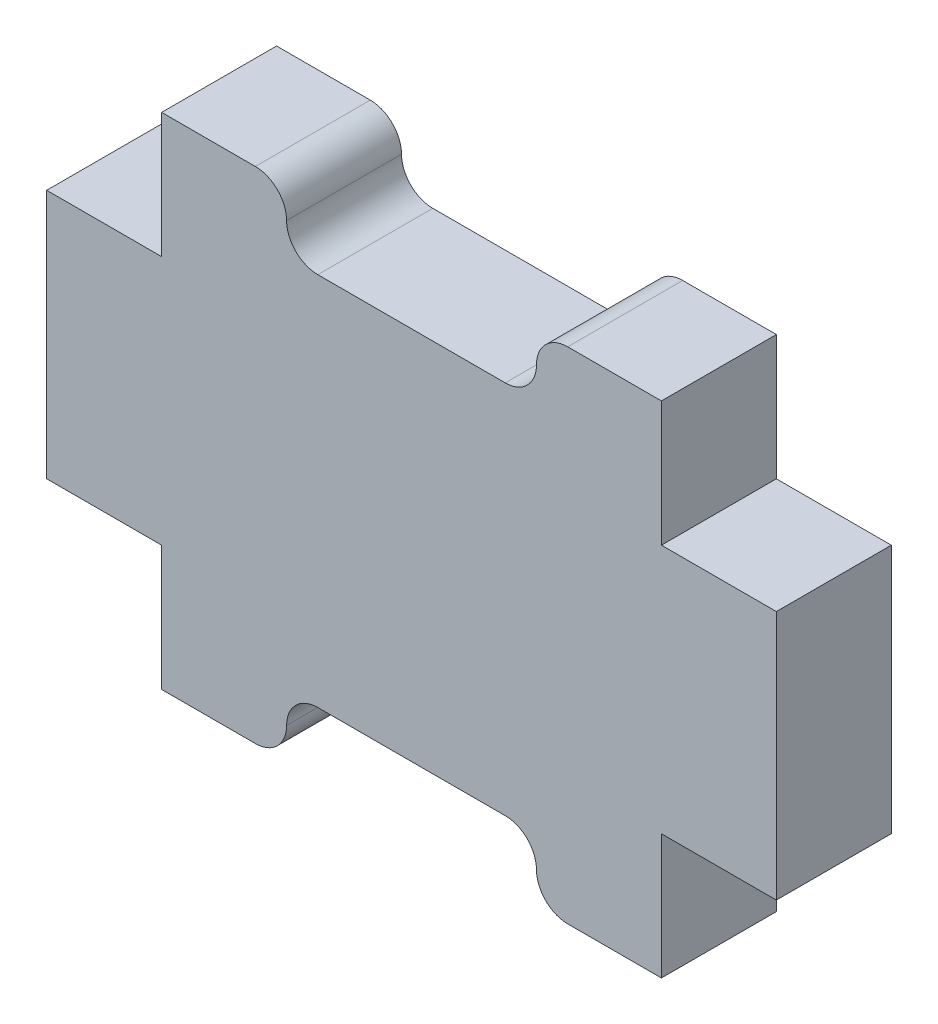
ISO-10303-21;
HEADER;
FILE_DESCRIPTION(('STEP AP214'),'2;1');
FILE_NAME('part.step','',(''),(''),'','','');
FILE_SCHEMA(('AUTOMOTIVE_DESIGN { 1 0 10303 214 1 1 1 1 }'));
ENDSEC;
DATA;
#1=APPLICATION_CONTEXT('core data for automotive mechanical design processes');
#2=APPLICATION_PROTOCOL_DEFINITION('international standard','automotive_design',2000,#1);
#3=PRODUCT_CONTEXT('',#1,'mechanical');
#4=PRODUCT('Part','Part','',(#3));
#5=PRODUCT_RELATED_PRODUCT_CATEGORY('part','',(#4));
#6=PRODUCT_DEFINITION_FORMATION('','',#4);
#7=PRODUCT_DEFINITION_CONTEXT('part definition',#1,'design');
#8=PRODUCT_DEFINITION('design','',#6,#7);
#9=PRODUCT_DEFINITION_SHAPE('','',#8);
#10=(LENGTH_UNIT() NAMED_UNIT(*) SI_UNIT(.MILLI.,.METRE.));
#11=(NAMED_UNIT(*) PLANE_ANGLE_UNIT() SI_UNIT($,.RADIAN.));
#12=(NAMED_UNIT(*) SI_UNIT($,.STERADIAN.) SOLID_ANGLE_UNIT());
#13=UNCERTAINTY_MEASURE_WITH_UNIT(LENGTH_MEASURE(1.E-05),#10,'distance_accuracy_value','');
#14=(GEOMETRIC_REPRESENTATION_CONTEXT(3) GLOBAL_UNCERTAINTY_ASSIGNED_CONTEXT((#13)) GLOBAL_UNIT_ASSIGNED_CONTEXT((#10,
#11,#12)) REPRESENTATION_CONTEXT('',''));
#15=CARTESIAN_POINT('',(0.,0.,0.));
#16=DIRECTION('',(0.,0.,1.));
#17=DIRECTION('',(1.,0.,0.));
#18=AXIS2_PLACEMENT_3D('',#15,#16,#17);
#19=CARTESIAN_POINT('',(0.,0.,5.842));
#20=DIRECTION('',(0.,1.,0.));
#21=DIRECTION('',(0.,0.,1.));
#22=AXIS2_PLACEMENT_3D('',#19,#20,#21);
#23=PLANE('',#22);
#24=DIRECTION('',(1.,0.,0.));
#25=VECTOR('',#24,1.);
#26=CARTESIAN_POINT('',(0.,0.,5.842));
#27=LINE('',#26,#25);
#28=CARTESIAN_POINT('',(-4.7625,0.,5.842));
#29=VERTEX_POINT('',#28);
#30=CARTESIAN_POINT('',(0.,0.,5.842));
#31=VERTEX_POINT('',#30);
#32=EDGE_CURVE('E221',#29,#31,#27,.T.);
#33=ORIENTED_EDGE('',*,*,#32,.F.);
#34=DIRECTION('',(0.,0.,1.));
#35=VECTOR('',#34,1.);
#36=CARTESIAN_POINT('',(-4.7625,0.,5.842));
#37=LINE('',#36,#35);
#38=CARTESIAN_POINT('',(-4.7625,0.,0.));
#39=VERTEX_POINT('',#38);
#40=EDGE_CURVE('E264',#29,#39,#37,.F.);
#41=ORIENTED_EDGE('',*,*,#40,.T.);
#42=DIRECTION('',(1.,0.,0.));
#43=VECTOR('',#42,1.);
#44=CARTESIAN_POINT('',(0.,0.,0.));
#45=LINE('',#44,#43);
#46=CARTESIAN_POINT('',(0.,0.,0.));
#47=VERTEX_POINT('',#46);
#48=EDGE_CURVE('E371',#39,#47,#45,.T.);
#49=ORIENTED_EDGE('',*,*,#48,.T.);
#50=DIRECTION('',(0.,0.,-1.));
#51=VECTOR('',#50,1.);
#52=CARTESIAN_POINT('',(0.,0.,5.842));
#53=LINE('',#52,#51);
#54=EDGE_CURVE('E323',#31,#47,#53,.T.);
#55=ORIENTED_EDGE('',*,*,#54,.F.);
#56=EDGE_LOOP('',(#33,#41,#49,#55));
#57=FACE_BOUND('',#56,.T.);
#58=ADVANCED_FACE('F39',(#57),#23,.F.);
#59=CARTESIAN_POINT('',(0.,25.4,5.842));
#60=DIRECTION('',(0.,-1.,0.));
#61=DIRECTION('',(0.,0.,-1.));
#62=AXIS2_PLACEMENT_3D('',#59,#60,#61);
#63=PLANE('',#62);
#64=DIRECTION('',(-1.,0.,0.));
#65=VECTOR('',#64,1.);
#66=CARTESIAN_POINT('',(0.,25.4,5.842));
#67=LINE('',#66,#65);
#68=CARTESIAN_POINT('',(-20.6375,25.4,5.842));
#69=VERTEX_POINT('',#68);
#70=CARTESIAN_POINT('',(-25.4,25.4,5.842));
#71=VERTEX_POINT('',#70);
#72=EDGE_CURVE('E292',#69,#71,#67,.T.);
#73=ORIENTED_EDGE('',*,*,#72,.F.);
#74=DIRECTION('',(0.,0.,1.));
#75=VECTOR('',#74,1.);
#76=CARTESIAN_POINT('',(-20.6375,25.4,5.842));
#77=LINE('',#76,#75);
#78=CARTESIAN_POINT('',(-20.6375,25.4,0.));
#79=VERTEX_POINT('',#78);
#80=EDGE_CURVE('E248',#69,#79,#77,.F.);
#81=ORIENTED_EDGE('',*,*,#80,.T.);
#82=DIRECTION('',(-1.,0.,0.));
#83=VECTOR('',#82,1.);
#84=CARTESIAN_POINT('',(0.,25.4,0.));
#85=LINE('',#84,#83);
#86=CARTESIAN_POINT('',(-25.4,25.4,0.));
#87=VERTEX_POINT('',#86);
#88=EDGE_CURVE('E413',#79,#87,#85,.T.);
#89=ORIENTED_EDGE('',*,*,#88,.T.);
#90=DIRECTION('',(0.,0.,-1.));
#91=VECTOR('',#90,1.);
#92=CARTESIAN_POINT('',(-25.4,25.4,5.842));
#93=LINE('',#92,#91);
#94=EDGE_CURVE('E391',#71,#87,#93,.T.);
#95=ORIENTED_EDGE('',*,*,#94,.F.);
#96=EDGE_LOOP('',(#73,#81,#89,#95));
#97=FACE_BOUND('',#96,.T.);
#98=ADVANCED_FACE('F475',(#97),#63,.F.);
#99=CARTESIAN_POINT('',(0.,0.,5.842));
#100=DIRECTION('',(-1.,0.,0.));
#101=DIRECTION('',(0.,0.,1.));
#102=AXIS2_PLACEMENT_3D('',#99,#100,#101);
#103=PLANE('',#102);
#104=DIRECTION('',(0.,1.,0.));
#105=VECTOR('',#104,1.);
#106=CARTESIAN_POINT('',(0.,0.,0.));
#107=LINE('',#106,#105);
#108=CARTESIAN_POINT('',(0.,6.34999999999999,0.));
#109=VERTEX_POINT('',#108);
#110=EDGE_CURVE('E230',#47,#109,#107,.T.);
#111=ORIENTED_EDGE('',*,*,#110,.T.);
#112=DIRECTION('',(0.,0.,-1.));
#113=VECTOR('',#112,1.);
#114=CARTESIAN_POINT('',(0.,6.34999999999999,5.842));
#115=LINE('',#114,#113);
#116=CARTESIAN_POINT('',(0.,6.34999999999999,5.842));
#117=VERTEX_POINT('',#116);
#118=EDGE_CURVE('E207',#117,#109,#115,.T.);
#119=ORIENTED_EDGE('',*,*,#118,.F.);
#120=DIRECTION('',(0.,1.,0.));
#121=VECTOR('',#120,1.);
#122=CARTESIAN_POINT('',(0.,0.,5.842));
#123=LINE('',#122,#121);
#124=EDGE_CURVE('E215',#31,#117,#123,.T.);
#125=ORIENTED_EDGE('',*,*,#124,.F.);
#126=ORIENTED_EDGE('',*,*,#54,.T.);
#127=EDGE_LOOP('',(#111,#119,#125,#126));
#128=FACE_BOUND('',#127,.T.);
#129=ADVANCED_FACE('F228',(#128),#103,.F.);
#130=CARTESIAN_POINT('',(0.,6.34999999999999,5.842));
#131=DIRECTION('',(0.,1.,0.));
#132=DIRECTION('',(-1.,0.,0.));
#133=AXIS2_PLACEMENT_3D('',#130,#131,#132);
#134=PLANE('',#133);
#135=DIRECTION('',(1.,0.,0.));
#136=VECTOR('',#135,1.);
#137=CARTESIAN_POINT('',(0.,6.34999999999999,0.));
#138=LINE('',#137,#136);
#139=CARTESIAN_POINT('',(5.842,6.35,0.));
#140=VERTEX_POINT('',#139);
#141=EDGE_CURVE('E415',#109,#140,#138,.T.);
#142=ORIENTED_EDGE('',*,*,#141,.T.);
#143=DIRECTION('',(0.,0.,-1.));
#144=VECTOR('',#143,1.);
#145=CARTESIAN_POINT('',(5.842,6.35,5.842));
#146=LINE('',#145,#144);
#147=CARTESIAN_POINT('',(5.842,6.35,5.842));
#148=VERTEX_POINT('',#147);
#149=EDGE_CURVE('E210',#148,#140,#146,.T.);
#150=ORIENTED_EDGE('',*,*,#149,.F.);
#151=DIRECTION('',(1.,0.,0.));
#152=VECTOR('',#151,1.);
#153=CARTESIAN_POINT('',(0.,6.34999999999999,5.842));
#154=LINE('',#153,#152);
#155=EDGE_CURVE('E203',#117,#148,#154,.T.);
#156=ORIENTED_EDGE('',*,*,#155,.F.);
#157=ORIENTED_EDGE('',*,*,#118,.T.);
#158=EDGE_LOOP('',(#142,#150,#156,#157));
#159=FACE_BOUND('',#158,.T.);
#160=ADVANCED_FACE('F205',(#159),#134,.F.);
#161=CARTESIAN_POINT('',(5.842,19.05,5.842));
#162=DIRECTION('',(-1.,0.,0.));
#163=DIRECTION('',(0.,-1.,0.));
#164=AXIS2_PLACEMENT_3D('',#161,#162,#163);
#165=PLANE('',#164);
#166=DIRECTION('',(0.,1.,0.));
#167=VECTOR('',#166,1.);
#168=CARTESIAN_POINT('',(5.842,19.05,0.));
#169=LINE('',#168,#167);
#170=CARTESIAN_POINT('',(5.842,19.05,0.));
#171=VERTEX_POINT('',#170);
#172=EDGE_CURVE('E410',#140,#171,#169,.T.);
#173=ORIENTED_EDGE('',*,*,#172,.T.);
#174=DIRECTION('',(0.,0.,-1.));
#175=VECTOR('',#174,1.);
#176=CARTESIAN_POINT('',(5.842,19.05,5.842));
#177=LINE('',#176,#175);
#178=CARTESIAN_POINT('',(5.842,19.05,5.842));
#179=VERTEX_POINT('',#178);
#180=EDGE_CURVE('E236',#179,#171,#177,.T.);
#181=ORIENTED_EDGE('',*,*,#180,.F.);
#182=DIRECTION('',(0.,1.,0.));
#183=VECTOR('',#182,1.);
#184=CARTESIAN_POINT('',(5.842,19.05,5.842));
#185=LINE('',#184,#183);
#186=EDGE_CURVE('E214',#148,#179,#185,.T.);
#187=ORIENTED_EDGE('',*,*,#186,.F.);
#188=ORIENTED_EDGE('',*,*,#149,.T.);
#189=EDGE_LOOP('',(#173,#181,#187,#188));
#190=FACE_BOUND('',#189,.T.);
#191=ADVANCED_FACE('F532',(#190),#165,.F.);
#192=CARTESIAN_POINT('',(0.,19.05,5.842));
#193=DIRECTION('',(0.,-1.,0.));
#194=DIRECTION('',(1.,0.,0.));
#195=AXIS2_PLACEMENT_3D('',#192,#193,#194);
#196=PLANE('',#195);
#197=DIRECTION('',(-1.,0.,0.));
#198=VECTOR('',#197,1.);
#199=CARTESIAN_POINT('',(0.,19.05,0.));
#200=LINE('',#199,#198);
#201=CARTESIAN_POINT('',(0.,19.05,0.));
#202=VERTEX_POINT('',#201);
#203=EDGE_CURVE('E406',#171,#202,#200,.T.);
#204=ORIENTED_EDGE('',*,*,#203,.T.);
#205=DIRECTION('',(0.,0.,-1.));
#206=VECTOR('',#205,1.);
#207=CARTESIAN_POINT('',(0.,19.05,5.842));
#208=LINE('',#207,#206);
#209=CARTESIAN_POINT('',(0.,19.05,5.842));
#210=VERTEX_POINT('',#209);
#211=EDGE_CURVE('E397',#210,#202,#208,.T.);
#212=ORIENTED_EDGE('',*,*,#211,.F.);
#213=DIRECTION('',(-1.,0.,0.));
#214=VECTOR('',#213,1.);
#215=CARTESIAN_POINT('',(0.,19.05,5.842));
#216=LINE('',#215,#214);
#217=EDGE_CURVE('E304',#179,#210,#216,.T.);
#218=ORIENTED_EDGE('',*,*,#217,.F.);
#219=ORIENTED_EDGE('',*,*,#180,.T.);
#220=EDGE_LOOP('',(#204,#212,#218,#219));
#221=FACE_BOUND('',#220,.T.);
#222=ADVANCED_FACE('F404',(#221),#196,.F.);
#223=CARTESIAN_POINT('',(0.,19.05,5.842));
#224=DIRECTION('',(-1.,0.,0.));
#225=DIRECTION('',(0.,0.,1.));
#226=AXIS2_PLACEMENT_3D('',#223,#224,#225);
#227=PLANE('',#226);
#228=DIRECTION('',(0.,1.,0.));
#229=VECTOR('',#228,1.);
#230=CARTESIAN_POINT('',(0.,19.05,0.));
#231=LINE('',#230,#229);
#232=CARTESIAN_POINT('',(0.,25.4,0.));
#233=VERTEX_POINT('',#232);
#234=EDGE_CURVE('E411',#202,#233,#231,.T.);
#235=ORIENTED_EDGE('',*,*,#234,.T.);
#236=DIRECTION('',(0.,0.,-1.));
#237=VECTOR('',#236,1.);
#238=CARTESIAN_POINT('',(0.,25.4,5.842));
#239=LINE('',#238,#237);
#240=CARTESIAN_POINT('',(0.,25.4,5.842));
#241=VERTEX_POINT('',#240);
#242=EDGE_CURVE('E394',#241,#233,#239,.T.);
#243=ORIENTED_EDGE('',*,*,#242,.F.);
#244=DIRECTION('',(0.,1.,0.));
#245=VECTOR('',#244,1.);
#246=CARTESIAN_POINT('',(0.,19.05,5.842));
#247=LINE('',#246,#245);
#248=EDGE_CURVE('E293',#210,#241,#247,.T.);
#249=ORIENTED_EDGE('',*,*,#248,.F.);
#250=ORIENTED_EDGE('',*,*,#211,.T.);
#251=EDGE_LOOP('',(#235,#243,#249,#250));
#252=FACE_BOUND('',#251,.T.);
#253=ADVANCED_FACE('F518',(#252),#227,.F.);
#254=CARTESIAN_POINT('',(-4.7625,25.4,0.));
#255=VERTEX_POINT('',#254);
#256=EDGE_CURVE('E418',#233,#255,#85,.T.);
#257=ORIENTED_EDGE('',*,*,#256,.T.);
#258=DIRECTION('',(0.,0.,1.));
#259=VECTOR('',#258,1.);
#260=CARTESIAN_POINT('',(-4.7625,25.4,5.842));
#261=LINE('',#260,#259);
#262=CARTESIAN_POINT('',(-4.7625,25.4,5.842));
#263=VERTEX_POINT('',#262);
#264=EDGE_CURVE('E261',#255,#263,#261,.T.);
#265=ORIENTED_EDGE('',*,*,#264,.T.);
#266=EDGE_CURVE('E286',#241,#263,#67,.T.);
#267=ORIENTED_EDGE('',*,*,#266,.F.);
#268=ORIENTED_EDGE('',*,*,#242,.T.);
#269=EDGE_LOOP('',(#257,#265,#267,#268));
#270=FACE_BOUND('',#269,.T.);
#271=ADVANCED_FACE('F472',(#270),#63,.F.);
#272=CARTESIAN_POINT('',(-25.4,19.05,5.842));
#273=DIRECTION('',(1.,0.,0.));
#274=DIRECTION('',(0.,1.,0.));
#275=AXIS2_PLACEMENT_3D('',#272,#273,#274);
#276=PLANE('',#275);
#277=DIRECTION('',(0.,-1.,0.));
#278=VECTOR('',#277,1.);
#279=CARTESIAN_POINT('',(-25.4,19.05,0.));
#280=LINE('',#279,#278);
#281=CARTESIAN_POINT('',(-25.4,19.05,0.));
#282=VERTEX_POINT('',#281);
#283=EDGE_CURVE('E420',#87,#282,#280,.T.);
#284=ORIENTED_EDGE('',*,*,#283,.T.);
#285=DIRECTION('',(0.,0.,-1.));
#286=VECTOR('',#285,1.);
#287=CARTESIAN_POINT('',(-25.4,19.05,5.842));
#288=LINE('',#287,#286);
#289=CARTESIAN_POINT('',(-25.4,19.05,5.842));
#290=VERTEX_POINT('',#289);
#291=EDGE_CURVE('E388',#290,#282,#288,.T.);
#292=ORIENTED_EDGE('',*,*,#291,.F.);
#293=DIRECTION('',(0.,-1.,0.));
#294=VECTOR('',#293,1.);
#295=CARTESIAN_POINT('',(-25.4,19.05,5.842));
#296=LINE('',#295,#294);
#297=EDGE_CURVE('E291',#71,#290,#296,.T.);
#298=ORIENTED_EDGE('',*,*,#297,.F.);
#299=ORIENTED_EDGE('',*,*,#94,.T.);
#300=EDGE_LOOP('',(#284,#292,#298,#299));
#301=FACE_BOUND('',#300,.T.);
#302=ADVANCED_FACE('F462',(#301),#276,.F.);
#303=CARTESIAN_POINT('',(-25.4,19.05,5.842));
#304=DIRECTION('',(0.,-1.,0.));
#305=DIRECTION('',(1.,0.,0.));
#306=AXIS2_PLACEMENT_3D('',#303,#304,#305);
#307=PLANE('',#306);
#308=DIRECTION('',(-1.,0.,0.));
#309=VECTOR('',#308,1.);
#310=CARTESIAN_POINT('',(-25.4,19.05,0.));
#311=LINE('',#310,#309);
#312=CARTESIAN_POINT('',(-31.242,19.05,0.));
#313=VERTEX_POINT('',#312);
#314=EDGE_CURVE('E422',#282,#313,#311,.T.);
#315=ORIENTED_EDGE('',*,*,#314,.T.);
#316=DIRECTION('',(0.,0.,-1.));
#317=VECTOR('',#316,1.);
#318=CARTESIAN_POINT('',(-31.242,19.05,5.842));
#319=LINE('',#318,#317);
#320=CARTESIAN_POINT('',(-31.242,19.05,5.842));
#321=VERTEX_POINT('',#320);
#322=EDGE_CURVE('E385',#321,#313,#319,.T.);
#323=ORIENTED_EDGE('',*,*,#322,.F.);
#324=DIRECTION('',(-1.,0.,0.));
#325=VECTOR('',#324,1.);
#326=CARTESIAN_POINT('',(-25.4,19.05,5.842));
#327=LINE('',#326,#325);
#328=EDGE_CURVE('E447',#290,#321,#327,.T.);
#329=ORIENTED_EDGE('',*,*,#328,.F.);
#330=ORIENTED_EDGE('',*,*,#291,.T.);
#331=EDGE_LOOP('',(#315,#323,#329,#330));
#332=FACE_BOUND('',#331,.T.);
#333=ADVANCED_FACE('F464',(#332),#307,.F.);
#334=CARTESIAN_POINT('',(-31.242,19.05,5.842));
#335=DIRECTION('',(1.,0.,0.));
#336=DIRECTION('',(0.,0.,-1.));
#337=AXIS2_PLACEMENT_3D('',#334,#335,#336);
#338=PLANE('',#337);
#339=DIRECTION('',(0.,-1.,0.));
#340=VECTOR('',#339,1.);
#341=CARTESIAN_POINT('',(-31.242,19.05,0.));
#342=LINE('',#341,#340);
#343=CARTESIAN_POINT('',(-31.242,6.35,0.));
#344=VERTEX_POINT('',#343);
#345=EDGE_CURVE('E424',#313,#344,#342,.T.);
#346=ORIENTED_EDGE('',*,*,#345,.T.);
#347=DIRECTION('',(0.,0.,-1.));
#348=VECTOR('',#347,1.);
#349=CARTESIAN_POINT('',(-31.242,6.35,5.842));
#350=LINE('',#349,#348);
#351=CARTESIAN_POINT('',(-31.242,6.35,5.842));
#352=VERTEX_POINT('',#351);
#353=EDGE_CURVE('E382',#352,#344,#350,.T.);
#354=ORIENTED_EDGE('',*,*,#353,.F.);
#355=DIRECTION('',(0.,-1.,0.));
#356=VECTOR('',#355,1.);
#357=CARTESIAN_POINT('',(-31.242,19.05,5.842));
#358=LINE('',#357,#356);
#359=EDGE_CURVE('E444',#321,#352,#358,.T.);
#360=ORIENTED_EDGE('',*,*,#359,.F.);
#361=ORIENTED_EDGE('',*,*,#322,.T.);
#362=EDGE_LOOP('',(#346,#354,#360,#361));
#363=FACE_BOUND('',#362,.T.);
#364=ADVANCED_FACE('F437',(#363),#338,.F.);
#365=CARTESIAN_POINT('',(-25.4,6.34999999999999,5.842));
#366=DIRECTION('',(0.,1.,0.));
#367=DIRECTION('',(-1.,0.,0.));
#368=AXIS2_PLACEMENT_3D('',#365,#366,#367);
#369=PLANE('',#368);
#370=DIRECTION('',(1.,0.,0.));
#371=VECTOR('',#370,1.);
#372=CARTESIAN_POINT('',(-25.4,6.34999999999999,0.));
#373=LINE('',#372,#371);
#374=CARTESIAN_POINT('',(-25.4,6.34999999999999,0.));
#375=VERTEX_POINT('',#374);
#376=EDGE_CURVE('E425',#344,#375,#373,.T.);
#377=ORIENTED_EDGE('',*,*,#376,.T.);
#378=DIRECTION('',(0.,0.,-1.));
#379=VECTOR('',#378,1.);
#380=CARTESIAN_POINT('',(-25.4,6.34999999999999,5.842));
#381=LINE('',#380,#379);
#382=CARTESIAN_POINT('',(-25.4,6.34999999999999,5.842));
#383=VERTEX_POINT('',#382);
#384=EDGE_CURVE('E379',#383,#375,#381,.T.);
#385=ORIENTED_EDGE('',*,*,#384,.F.);
#386=DIRECTION('',(1.,0.,0.));
#387=VECTOR('',#386,1.);
#388=CARTESIAN_POINT('',(-25.4,6.34999999999999,5.842));
#389=LINE('',#388,#387);
#390=EDGE_CURVE('E442',#352,#383,#389,.T.);
#391=ORIENTED_EDGE('',*,*,#390,.F.);
#392=ORIENTED_EDGE('',*,*,#353,.T.);
#393=EDGE_LOOP('',(#377,#385,#391,#392));
#394=FACE_BOUND('',#393,.T.);
#395=ADVANCED_FACE('F441',(#394),#369,.F.);
#396=CARTESIAN_POINT('',(-25.4,0.,5.842));
#397=DIRECTION('',(1.,0.,0.));
#398=DIRECTION('',(0.,1.,0.));
#399=AXIS2_PLACEMENT_3D('',#396,#397,#398);
#400=PLANE('',#399);
#401=DIRECTION('',(0.,-1.,0.));
#402=VECTOR('',#401,1.);
#403=CARTESIAN_POINT('',(-25.4,0.,0.));
#404=LINE('',#403,#402);
#405=CARTESIAN_POINT('',(-25.4,0.,0.));
#406=VERTEX_POINT('',#405);
#407=EDGE_CURVE('E373',#375,#406,#404,.T.);
#408=ORIENTED_EDGE('',*,*,#407,.T.);
#409=DIRECTION('',(0.,0.,-1.));
#410=VECTOR('',#409,1.);
#411=CARTESIAN_POINT('',(-25.4,0.,5.842));
#412=LINE('',#411,#410);
#413=CARTESIAN_POINT('',(-25.4,0.,5.842));
#414=VERTEX_POINT('',#413);
#415=EDGE_CURVE('E370',#414,#406,#412,.T.);
#416=ORIENTED_EDGE('',*,*,#415,.F.);
#417=DIRECTION('',(0.,-1.,0.));
#418=VECTOR('',#417,1.);
#419=CARTESIAN_POINT('',(-25.4,0.,5.842));
#420=LINE('',#419,#418);
#421=EDGE_CURVE('E324',#383,#414,#420,.T.);
#422=ORIENTED_EDGE('',*,*,#421,.F.);
#423=ORIENTED_EDGE('',*,*,#384,.T.);
#424=EDGE_LOOP('',(#408,#416,#422,#423));
#425=FACE_BOUND('',#424,.T.);
#426=ADVANCED_FACE('F430',(#425),#400,.F.);
#427=CARTESIAN_POINT('',(-20.6375,0.,0.));
#428=VERTEX_POINT('',#427);
#429=EDGE_CURVE('E226',#406,#428,#45,.T.);
#430=ORIENTED_EDGE('',*,*,#429,.T.);
#431=DIRECTION('',(0.,0.,1.));
#432=VECTOR('',#431,1.);
#433=CARTESIAN_POINT('',(-20.6375,0.,5.842));
#434=LINE('',#433,#432);
#435=CARTESIAN_POINT('',(-20.6375,0.,5.842));
#436=VERTEX_POINT('',#435);
#437=EDGE_CURVE('E271',#428,#436,#434,.T.);
#438=ORIENTED_EDGE('',*,*,#437,.T.);
#439=EDGE_CURVE('E317',#414,#436,#27,.T.);
#440=ORIENTED_EDGE('',*,*,#439,.F.);
#441=ORIENTED_EDGE('',*,*,#415,.T.);
#442=EDGE_LOOP('',(#430,#438,#440,#441));
#443=FACE_BOUND('',#442,.T.);
#444=ADVANCED_FACE('F367',(#443),#23,.F.);
#445=CARTESIAN_POINT('',(0.,0.,5.842));
#446=DIRECTION('',(0.,0.,-1.));
#447=DIRECTION('',(-1.,0.,0.));
#448=AXIS2_PLACEMENT_3D('',#445,#446,#447);
#449=PLANE('',#448);
#450=DIRECTION('',(1.,0.,0.));
#451=VECTOR('',#450,1.);
#452=CARTESIAN_POINT('',(-6.35,22.225,5.842));
#453=LINE('',#452,#451);
#454=CARTESIAN_POINT('',(-17.4625,22.225,5.842));
#455=VERTEX_POINT('',#454);
#456=CARTESIAN_POINT('',(-7.9375,22.225,5.842));
#457=VERTEX_POINT('',#456);
#458=EDGE_CURVE('E697',#455,#457,#453,.T.);
#459=ORIENTED_EDGE('',*,*,#458,.F.);
#460=CARTESIAN_POINT('',(-17.4625,23.8125,5.842));
#461=DIRECTION('',(0.,0.,-1.));
#462=DIRECTION('',(-1.,0.,0.));
#463=AXIS2_PLACEMENT_3D('',#460,#461,#462);
#464=CIRCLE('',#463,1.5875);
#465=CARTESIAN_POINT('',(-19.05,23.8125,5.842));
#466=VERTEX_POINT('',#465);
#467=EDGE_CURVE('E273',#455,#466,#464,.T.);
#468=ORIENTED_EDGE('',*,*,#467,.T.);
#469=CARTESIAN_POINT('',(-20.6375,23.8125,5.842));
#470=DIRECTION('',(0.,0.,-1.));
#471=DIRECTION('',(-1.,0.,0.));
#472=AXIS2_PLACEMENT_3D('',#469,#470,#471);
#473=CIRCLE('',#472,1.5875);
#474=EDGE_CURVE('E245',#466,#69,#473,.F.);
#475=ORIENTED_EDGE('',*,*,#474,.T.);
#476=ORIENTED_EDGE('',*,*,#72,.T.);
#477=ORIENTED_EDGE('',*,*,#297,.T.);
#478=ORIENTED_EDGE('',*,*,#328,.T.);
#479=ORIENTED_EDGE('',*,*,#359,.T.);
#480=ORIENTED_EDGE('',*,*,#390,.T.);
#481=ORIENTED_EDGE('',*,*,#421,.T.);
#482=ORIENTED_EDGE('',*,*,#439,.T.);
#483=CARTESIAN_POINT('',(-20.6375,1.5875,5.842));
#484=DIRECTION('',(0.,0.,-1.));
#485=DIRECTION('',(-1.,0.,0.));
#486=AXIS2_PLACEMENT_3D('',#483,#484,#485);
#487=CIRCLE('',#486,1.5875);
#488=CARTESIAN_POINT('',(-19.05,1.5875,5.842));
#489=VERTEX_POINT('',#488);
#490=EDGE_CURVE('E231',#436,#489,#487,.F.);
#491=ORIENTED_EDGE('',*,*,#490,.T.);
#492=CARTESIAN_POINT('',(-17.4625,1.5875,5.842));
#493=DIRECTION('',(0.,0.,-1.));
#494=DIRECTION('',(-1.,0.,0.));
#495=AXIS2_PLACEMENT_3D('',#492,#493,#494);
#496=CIRCLE('',#495,1.5875);
#497=CARTESIAN_POINT('',(-17.4625,3.175,5.842));
#498=VERTEX_POINT('',#497);
#499=EDGE_CURVE('E48',#489,#498,#496,.T.);
#500=ORIENTED_EDGE('',*,*,#499,.T.);
#501=DIRECTION('',(-1.,0.,0.));
#502=VECTOR('',#501,1.);
#503=CARTESIAN_POINT('',(-6.35,3.175,5.842));
#504=LINE('',#503,#502);
#505=CARTESIAN_POINT('',(-7.9375,3.175,5.842));
#506=VERTEX_POINT('',#505);
#507=EDGE_CURVE('E343',#506,#498,#504,.T.);
#508=ORIENTED_EDGE('',*,*,#507,.F.);
#509=CARTESIAN_POINT('',(-7.9375,1.5875,5.842));
#510=DIRECTION('',(0.,0.,-1.));
#511=DIRECTION('',(-1.,0.,0.));
#512=AXIS2_PLACEMENT_3D('',#509,#510,#511);
#513=CIRCLE('',#512,1.5875);
#514=CARTESIAN_POINT('',(-6.35,1.5875,5.842));
#515=VERTEX_POINT('',#514);
#516=EDGE_CURVE('E690',#506,#515,#513,.T.);
#517=ORIENTED_EDGE('',*,*,#516,.T.);
#518=CARTESIAN_POINT('',(-4.7625,1.5875,5.842));
#519=DIRECTION('',(0.,0.,-1.));
#520=DIRECTION('',(-1.,0.,0.));
#521=AXIS2_PLACEMENT_3D('',#518,#519,#520);
#522=CIRCLE('',#521,1.5875);
#523=EDGE_CURVE('E234',#515,#29,#522,.F.);
#524=ORIENTED_EDGE('',*,*,#523,.T.);
#525=ORIENTED_EDGE('',*,*,#32,.T.);
#526=ORIENTED_EDGE('',*,*,#124,.T.);
#527=ORIENTED_EDGE('',*,*,#155,.T.);
#528=ORIENTED_EDGE('',*,*,#186,.T.);
#529=ORIENTED_EDGE('',*,*,#217,.T.);
#530=ORIENTED_EDGE('',*,*,#248,.T.);
#531=ORIENTED_EDGE('',*,*,#266,.T.);
#532=CARTESIAN_POINT('',(-4.7625,23.8125,5.842));
#533=DIRECTION('',(0.,0.,-1.));
#534=DIRECTION('',(-1.,0.,0.));
#535=AXIS2_PLACEMENT_3D('',#532,#533,#534);
#536=CIRCLE('',#535,1.5875);
#537=CARTESIAN_POINT('',(-6.35,23.8125,5.842));
#538=VERTEX_POINT('',#537);
#539=EDGE_CURVE('E242',#263,#538,#536,.F.);
#540=ORIENTED_EDGE('',*,*,#539,.T.);
#541=CARTESIAN_POINT('',(-7.9375,23.8125,5.842));
#542=DIRECTION('',(0.,0.,-1.));
#543=DIRECTION('',(-1.,0.,0.));
#544=AXIS2_PLACEMENT_3D('',#541,#542,#543);
#545=CIRCLE('',#544,1.5875);
#546=EDGE_CURVE('E713',#538,#457,#545,.T.);
#547=ORIENTED_EDGE('',*,*,#546,.T.);
#548=EDGE_LOOP('',(#459,#468,#475,#476,#477,#478,#479,#480,#481,#482,#491,#500,#508,#517,#524,
#525,#526,#527,#528,#529,#530,#531,#540,#547));
#549=FACE_BOUND('',#548,.T.);
#550=ADVANCED_FACE('F219',(#549),#449,.F.);
#551=CARTESIAN_POINT('',(0.,0.,0.));
#552=DIRECTION('',(0.,0.,-1.));
#553=DIRECTION('',(-1.,0.,0.));
#554=AXIS2_PLACEMENT_3D('',#551,#552,#553);
#555=PLANE('',#554);
#556=ORIENTED_EDGE('',*,*,#88,.F.);
#557=CARTESIAN_POINT('',(-20.6375,23.8125,0.));
#558=DIRECTION('',(0.,0.,-1.));
#559=DIRECTION('',(-1.,0.,0.));
#560=AXIS2_PLACEMENT_3D('',#557,#558,#559);
#561=CIRCLE('',#560,1.5875);
#562=CARTESIAN_POINT('',(-19.05,23.8125,0.));
#563=VERTEX_POINT('',#562);
#564=EDGE_CURVE('E255',#79,#563,#561,.T.);
#565=ORIENTED_EDGE('',*,*,#564,.T.);
#566=CARTESIAN_POINT('',(-17.4625,23.8125,0.));
#567=DIRECTION('',(0.,0.,-1.));
#568=DIRECTION('',(-1.,0.,0.));
#569=AXIS2_PLACEMENT_3D('',#566,#567,#568);
#570=CIRCLE('',#569,1.5875);
#571=CARTESIAN_POINT('',(-17.4625,22.225,0.));
#572=VERTEX_POINT('',#571);
#573=EDGE_CURVE('E277',#563,#572,#570,.F.);
#574=ORIENTED_EDGE('',*,*,#573,.T.);
#575=DIRECTION('',(1.,0.,0.));
#576=VECTOR('',#575,1.);
#577=CARTESIAN_POINT('',(-6.35,22.225,0.));
#578=LINE('',#577,#576);
#579=CARTESIAN_POINT('',(-7.9375,22.225,0.));
#580=VERTEX_POINT('',#579);
#581=EDGE_CURVE('E701',#572,#580,#578,.T.);
#582=ORIENTED_EDGE('',*,*,#581,.T.);
#583=CARTESIAN_POINT('',(-7.9375,23.8125,0.));
#584=DIRECTION('',(0.,0.,-1.));
#585=DIRECTION('',(-1.,0.,0.));
#586=AXIS2_PLACEMENT_3D('',#583,#584,#585);
#587=CIRCLE('',#586,1.5875);
#588=CARTESIAN_POINT('',(-6.35,23.8125,0.));
#589=VERTEX_POINT('',#588);
#590=EDGE_CURVE('E714',#580,#589,#587,.F.);
#591=ORIENTED_EDGE('',*,*,#590,.T.);
#592=CARTESIAN_POINT('',(-4.7625,23.8125,0.));
#593=DIRECTION('',(0.,0.,-1.));
#594=DIRECTION('',(-1.,0.,0.));
#595=AXIS2_PLACEMENT_3D('',#592,#593,#594);
#596=CIRCLE('',#595,1.5875);
#597=EDGE_CURVE('E64',#589,#255,#596,.T.);
#598=ORIENTED_EDGE('',*,*,#597,.T.);
#599=ORIENTED_EDGE('',*,*,#256,.F.);
#600=ORIENTED_EDGE('',*,*,#234,.F.);
#601=ORIENTED_EDGE('',*,*,#203,.F.);
#602=ORIENTED_EDGE('',*,*,#172,.F.);
#603=ORIENTED_EDGE('',*,*,#141,.F.);
#604=ORIENTED_EDGE('',*,*,#110,.F.);
#605=ORIENTED_EDGE('',*,*,#48,.F.);
#606=CARTESIAN_POINT('',(-4.7625,1.5875,0.));
#607=DIRECTION('',(0.,0.,-1.));
#608=DIRECTION('',(-1.,0.,0.));
#609=AXIS2_PLACEMENT_3D('',#606,#607,#608);
#610=CIRCLE('',#609,1.5875);
#611=CARTESIAN_POINT('',(-6.35,1.5875,0.));
#612=VERTEX_POINT('',#611);
#613=EDGE_CURVE('E56',#39,#612,#610,.T.);
#614=ORIENTED_EDGE('',*,*,#613,.T.);
#615=CARTESIAN_POINT('',(-7.9375,1.5875,0.));
#616=DIRECTION('',(0.,0.,-1.));
#617=DIRECTION('',(-1.,0.,0.));
#618=AXIS2_PLACEMENT_3D('',#615,#616,#617);
#619=CIRCLE('',#618,1.5875);
#620=CARTESIAN_POINT('',(-7.9375,3.175,0.));
#621=VERTEX_POINT('',#620);
#622=EDGE_CURVE('E338',#612,#621,#619,.F.);
#623=ORIENTED_EDGE('',*,*,#622,.T.);
#624=DIRECTION('',(-1.,0.,0.));
#625=VECTOR('',#624,1.);
#626=CARTESIAN_POINT('',(-6.35,3.175,0.));
#627=LINE('',#626,#625);
#628=CARTESIAN_POINT('',(-17.4625,3.175,0.));
#629=VERTEX_POINT('',#628);
#630=EDGE_CURVE('E694',#621,#629,#627,.T.);
#631=ORIENTED_EDGE('',*,*,#630,.T.);
#632=CARTESIAN_POINT('',(-17.4625,1.5875,0.));
#633=DIRECTION('',(0.,0.,-1.));
#634=DIRECTION('',(-1.,0.,0.));
#635=AXIS2_PLACEMENT_3D('',#632,#633,#634);
#636=CIRCLE('',#635,1.5875);
#637=CARTESIAN_POINT('',(-19.05,1.5875,0.));
#638=VERTEX_POINT('',#637);
#639=EDGE_CURVE('E12',#629,#638,#636,.F.);
#640=ORIENTED_EDGE('',*,*,#639,.T.);
#641=CARTESIAN_POINT('',(-20.6375,1.5875,0.));
#642=DIRECTION('',(0.,0.,-1.));
#643=DIRECTION('',(-1.,0.,0.));
#644=AXIS2_PLACEMENT_3D('',#641,#642,#643);
#645=CIRCLE('',#644,1.5875);
#646=EDGE_CURVE('E251',#638,#428,#645,.T.);
#647=ORIENTED_EDGE('',*,*,#646,.T.);
#648=ORIENTED_EDGE('',*,*,#429,.F.);
#649=ORIENTED_EDGE('',*,*,#407,.F.);
#650=ORIENTED_EDGE('',*,*,#376,.F.);
#651=ORIENTED_EDGE('',*,*,#345,.F.);
#652=ORIENTED_EDGE('',*,*,#314,.F.);
#653=ORIENTED_EDGE('',*,*,#283,.F.);
#654=EDGE_LOOP('',(#556,#565,#574,#582,#591,#598,#599,#600,#601,#602,#603,#604,#605,#614,#623,
#631,#640,#647,#648,#649,#650,#651,#652,#653));
#655=FACE_BOUND('',#654,.T.);
#656=ADVANCED_FACE('F362',(#655),#555,.T.);
#657=CARTESIAN_POINT('',(-6.35,22.225,0.));
#658=DIRECTION('',(0.,-1.,0.));
#659=DIRECTION('',(1.,0.,0.));
#660=AXIS2_PLACEMENT_3D('',#657,#658,#659);
#661=PLANE('',#660);
#662=ORIENTED_EDGE('',*,*,#581,.F.);
#663=DIRECTION('',(0.,0.,1.));
#664=VECTOR('',#663,1.);
#665=CARTESIAN_POINT('',(-17.4625,22.225,5.842));
#666=LINE('',#665,#664);
#667=EDGE_CURVE('E259',#572,#455,#666,.T.);
#668=ORIENTED_EDGE('',*,*,#667,.T.);
#669=ORIENTED_EDGE('',*,*,#458,.T.);
#670=DIRECTION('',(0.,0.,1.));
#671=VECTOR('',#670,1.);
#672=CARTESIAN_POINT('',(-7.9375,22.225,0.));
#673=LINE('',#672,#671);
#674=EDGE_CURVE('E257',#457,#580,#673,.F.);
#675=ORIENTED_EDGE('',*,*,#674,.T.);
#676=EDGE_LOOP('',(#662,#668,#669,#675));
#677=FACE_BOUND('',#676,.T.);
#678=ADVANCED_FACE('F592',(#677),#661,.F.);
#679=CARTESIAN_POINT('',(-6.35,3.175,0.));
#680=DIRECTION('',(0.,1.,0.));
#681=DIRECTION('',(0.,0.,1.));
#682=AXIS2_PLACEMENT_3D('',#679,#680,#681);
#683=PLANE('',#682);
#684=ORIENTED_EDGE('',*,*,#630,.F.);
#685=DIRECTION('',(0.,0.,1.));
#686=VECTOR('',#685,1.);
#687=CARTESIAN_POINT('',(-7.9375,3.175,5.842));
#688=LINE('',#687,#686);
#689=EDGE_CURVE('E269',#621,#506,#688,.T.);
#690=ORIENTED_EDGE('',*,*,#689,.T.);
#691=ORIENTED_EDGE('',*,*,#507,.T.);
#692=DIRECTION('',(0.,0.,1.));
#693=VECTOR('',#692,1.);
#694=CARTESIAN_POINT('',(-17.4625,3.175,0.));
#695=LINE('',#694,#693);
#696=EDGE_CURVE('E266',#498,#629,#695,.F.);
#697=ORIENTED_EDGE('',*,*,#696,.T.);
#698=EDGE_LOOP('',(#684,#690,#691,#697));
#699=FACE_BOUND('',#698,.T.);
#700=ADVANCED_FACE('F600',(#699),#683,.F.);
#701=CARTESIAN_POINT('',(-17.4625,23.8125,0.));
#702=DIRECTION('',(0.,0.,-1.));
#703=DIRECTION('',(-1.,0.,0.));
#704=AXIS2_PLACEMENT_3D('',#701,#702,#703);
#705=CYLINDRICAL_SURFACE('',#704,1.5875);
#706=ORIENTED_EDGE('',*,*,#667,.F.);
#707=ORIENTED_EDGE('',*,*,#573,.F.);
#708=DIRECTION('',(0.,0.,1.));
#709=VECTOR('',#708,1.);
#710=CARTESIAN_POINT('',(-19.05,23.8125,0.));
#711=LINE('',#710,#709);
#712=EDGE_CURVE('E340',#466,#563,#711,.F.);
#713=ORIENTED_EDGE('',*,*,#712,.F.);
#714=ORIENTED_EDGE('',*,*,#467,.F.);
#715=EDGE_LOOP('',(#706,#707,#713,#714));
#716=FACE_BOUND('',#715,.T.);
#717=ADVANCED_FACE('F610',(#716),#705,.F.);
#718=CARTESIAN_POINT('',(-20.6375,23.8125,0.));
#719=DIRECTION('',(0.,0.,1.));
#720=DIRECTION('',(1.,0.,0.));
#721=AXIS2_PLACEMENT_3D('',#718,#719,#720);
#722=CYLINDRICAL_SURFACE('',#721,1.5875);
#723=ORIENTED_EDGE('',*,*,#564,.F.);
#724=ORIENTED_EDGE('',*,*,#80,.F.);
#725=ORIENTED_EDGE('',*,*,#474,.F.);
#726=ORIENTED_EDGE('',*,*,#712,.T.);
#727=EDGE_LOOP('',(#723,#724,#725,#726));
#728=FACE_BOUND('',#727,.T.);
#729=ADVANCED_FACE('F620',(#728),#722,.T.);
#730=CARTESIAN_POINT('',(-7.9375,23.8125,0.));
#731=DIRECTION('',(0.,0.,-1.));
#732=DIRECTION('',(-1.,0.,0.));
#733=AXIS2_PLACEMENT_3D('',#730,#731,#732);
#734=CYLINDRICAL_SURFACE('',#733,1.5875);
#735=DIRECTION('',(0.,0.,1.));
#736=VECTOR('',#735,1.);
#737=CARTESIAN_POINT('',(-6.35,23.8125,5.842));
#738=LINE('',#737,#736);
#739=EDGE_CURVE('E344',#589,#538,#738,.T.);
#740=ORIENTED_EDGE('',*,*,#739,.F.);
#741=ORIENTED_EDGE('',*,*,#590,.F.);
#742=ORIENTED_EDGE('',*,*,#674,.F.);
#743=ORIENTED_EDGE('',*,*,#546,.F.);
#744=EDGE_LOOP('',(#740,#741,#742,#743));
#745=FACE_BOUND('',#744,.T.);
#746=ADVANCED_FACE('F630',(#745),#734,.F.);
#747=CARTESIAN_POINT('',(-4.7625,23.8125,5.842));
#748=DIRECTION('',(0.,0.,1.));
#749=DIRECTION('',(1.,0.,0.));
#750=AXIS2_PLACEMENT_3D('',#747,#748,#749);
#751=CYLINDRICAL_SURFACE('',#750,1.5875);
#752=ORIENTED_EDGE('',*,*,#597,.F.);
#753=ORIENTED_EDGE('',*,*,#739,.T.);
#754=ORIENTED_EDGE('',*,*,#539,.F.);
#755=ORIENTED_EDGE('',*,*,#264,.F.);
#756=EDGE_LOOP('',(#752,#753,#754,#755));
#757=FACE_BOUND('',#756,.T.);
#758=ADVANCED_FACE('F640',(#757),#751,.T.);
#759=CARTESIAN_POINT('',(-7.9375,1.5875,0.));
#760=DIRECTION('',(0.,0.,-1.));
#761=DIRECTION('',(-1.,0.,0.));
#762=AXIS2_PLACEMENT_3D('',#759,#760,#761);
#763=CYLINDRICAL_SURFACE('',#762,1.5875);
#764=ORIENTED_EDGE('',*,*,#689,.F.);
#765=ORIENTED_EDGE('',*,*,#622,.F.);
#766=DIRECTION('',(0.,0.,1.));
#767=VECTOR('',#766,1.);
#768=CARTESIAN_POINT('',(-6.35,1.5875,0.));
#769=LINE('',#768,#767);
#770=EDGE_CURVE('E346',#515,#612,#769,.F.);
#771=ORIENTED_EDGE('',*,*,#770,.F.);
#772=ORIENTED_EDGE('',*,*,#516,.F.);
#773=EDGE_LOOP('',(#764,#765,#771,#772));
#774=FACE_BOUND('',#773,.T.);
#775=ADVANCED_FACE('F650',(#774),#763,.F.);
#776=CARTESIAN_POINT('',(-4.7625,1.5875,0.));
#777=DIRECTION('',(0.,0.,1.));
#778=DIRECTION('',(1.,0.,0.));
#779=AXIS2_PLACEMENT_3D('',#776,#777,#778);
#780=CYLINDRICAL_SURFACE('',#779,1.5875);
#781=ORIENTED_EDGE('',*,*,#613,.F.);
#782=ORIENTED_EDGE('',*,*,#40,.F.);
#783=ORIENTED_EDGE('',*,*,#523,.F.);
#784=ORIENTED_EDGE('',*,*,#770,.T.);
#785=EDGE_LOOP('',(#781,#782,#783,#784));
#786=FACE_BOUND('',#785,.T.);
#787=ADVANCED_FACE('F660',(#786),#780,.T.);
#788=CARTESIAN_POINT('',(-20.6375,1.5875,5.842));
#789=DIRECTION('',(0.,0.,1.));
#790=DIRECTION('',(1.,0.,0.));
#791=AXIS2_PLACEMENT_3D('',#788,#789,#790);
#792=CYLINDRICAL_SURFACE('',#791,1.5875);
#793=ORIENTED_EDGE('',*,*,#437,.F.);
#794=ORIENTED_EDGE('',*,*,#646,.F.);
#795=DIRECTION('',(0.,0.,1.));
#796=VECTOR('',#795,1.);
#797=CARTESIAN_POINT('',(-19.05,1.5875,0.));
#798=LINE('',#797,#796);
#799=EDGE_CURVE('E43',#489,#638,#798,.F.);
#800=ORIENTED_EDGE('',*,*,#799,.F.);
#801=ORIENTED_EDGE('',*,*,#490,.F.);
#802=EDGE_LOOP('',(#793,#794,#800,#801));
#803=FACE_BOUND('',#802,.T.);
#804=ADVANCED_FACE('F41',(#803),#792,.T.);
#805=CARTESIAN_POINT('',(-17.4625,1.5875,0.));
#806=DIRECTION('',(0.,0.,-1.));
#807=DIRECTION('',(-1.,0.,0.));
#808=AXIS2_PLACEMENT_3D('',#805,#806,#807);
#809=CYLINDRICAL_SURFACE('',#808,1.5875);
#810=ORIENTED_EDGE('',*,*,#639,.F.);
#811=ORIENTED_EDGE('',*,*,#696,.F.);
#812=ORIENTED_EDGE('',*,*,#499,.F.);
#813=ORIENTED_EDGE('',*,*,#799,.T.);
#814=EDGE_LOOP('',(#810,#811,#812,#813));
#815=FACE_BOUND('',#814,.T.);
#816=ADVANCED_FACE('F353',(#815),#809,.F.);
#817=CLOSED_SHELL('',(#58,#98,#129,#160,#191,#222,#253,#271,#302,#333,#364,#395,#426,#444,#550,
#656,#678,#700,#717,#729,#746,#758,#775,#787,#804,#816));
#818=MANIFOLD_SOLID_BREP('B2',#817);
#819=ADVANCED_BREP_SHAPE_REPRESENTATION('',(#18,#818),#14);
#820=SHAPE_DEFINITION_REPRESENTATION(#9,#819);
ENDSEC;
END-ISO-10303-21;
